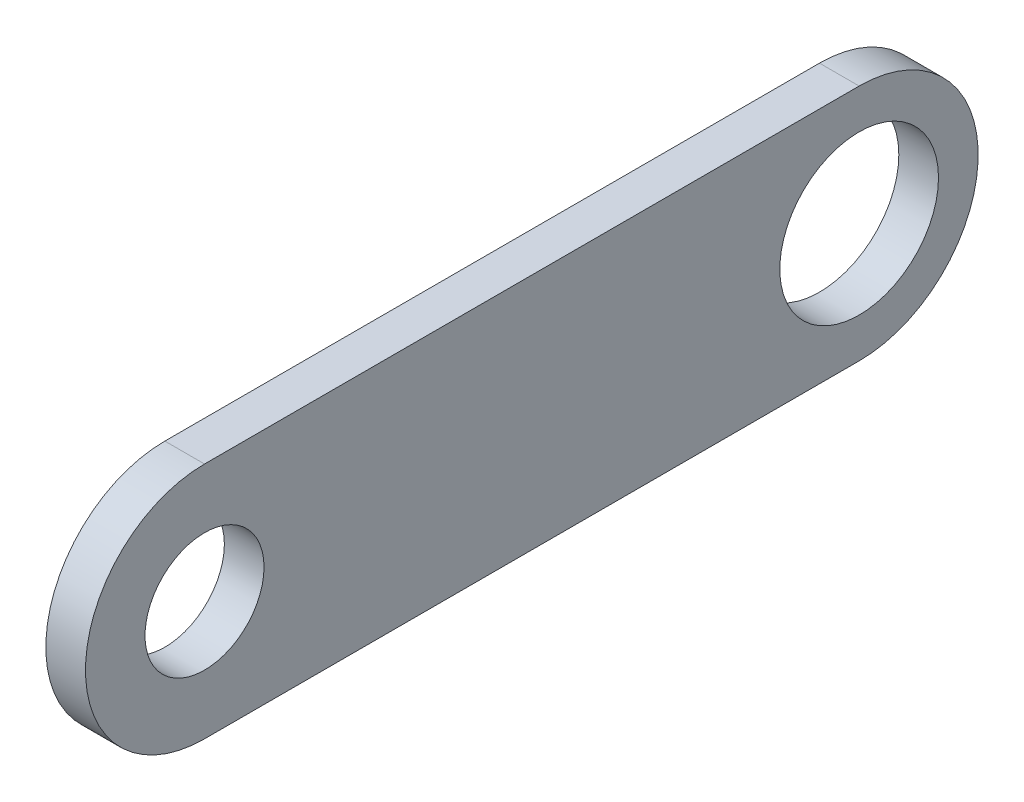
ISO-10303-21;
HEADER;
FILE_DESCRIPTION(('STEP AP214'),'2;1');
FILE_NAME('part.step','',(''),(''),'','','');
FILE_SCHEMA(('AUTOMOTIVE_DESIGN { 1 0 10303 214 1 1 1 1 }'));
ENDSEC;
DATA;
#1=APPLICATION_CONTEXT('core data for automotive mechanical design processes');
#2=APPLICATION_PROTOCOL_DEFINITION('international standard','automotive_design',2000,#1);
#3=PRODUCT_CONTEXT('',#1,'mechanical');
#4=PRODUCT('Part','Part','',(#3));
#5=PRODUCT_RELATED_PRODUCT_CATEGORY('part','',(#4));
#6=PRODUCT_DEFINITION_FORMATION('','',#4);
#7=PRODUCT_DEFINITION_CONTEXT('part definition',#1,'design');
#8=PRODUCT_DEFINITION('design','',#6,#7);
#9=PRODUCT_DEFINITION_SHAPE('','',#8);
#10=(LENGTH_UNIT() NAMED_UNIT(*) SI_UNIT(.MILLI.,.METRE.));
#11=(NAMED_UNIT(*) PLANE_ANGLE_UNIT() SI_UNIT($,.RADIAN.));
#12=(NAMED_UNIT(*) SI_UNIT($,.STERADIAN.) SOLID_ANGLE_UNIT());
#13=UNCERTAINTY_MEASURE_WITH_UNIT(LENGTH_MEASURE(1.E-05),#10,'distance_accuracy_value','');
#14=(GEOMETRIC_REPRESENTATION_CONTEXT(3) GLOBAL_UNCERTAINTY_ASSIGNED_CONTEXT((#13)) GLOBAL_UNIT_ASSIGNED_CONTEXT((#10,
#11,#12)) REPRESENTATION_CONTEXT('',''));
#15=CARTESIAN_POINT('',(0.,0.,0.));
#16=DIRECTION('',(0.,0.,1.));
#17=DIRECTION('',(1.,0.,0.));
#18=AXIS2_PLACEMENT_3D('',#15,#16,#17);
#19=CARTESIAN_POINT('',(2.,0.,-33.));
#20=DIRECTION('',(-1.,0.,0.));
#21=DIRECTION('',(0.,0.,1.));
#22=AXIS2_PLACEMENT_3D('',#19,#20,#21);
#23=CYLINDRICAL_SURFACE('',#22,6.);
#24=CARTESIAN_POINT('',(0.,0.,-33.));
#25=DIRECTION('',(-1.,0.,0.));
#26=DIRECTION('',(0.,0.,1.));
#27=AXIS2_PLACEMENT_3D('',#24,#25,#26);
#28=CIRCLE('',#27,6.);
#29=CARTESIAN_POINT('',(0.,6.,-33.));
#30=VERTEX_POINT('',#29);
#31=CARTESIAN_POINT('',(0.,-6.,-33.));
#32=VERTEX_POINT('',#31);
#33=EDGE_CURVE('E98',#30,#32,#28,.T.);
#34=ORIENTED_EDGE('',*,*,#33,.F.);
#35=DIRECTION('',(-1.,0.,0.));
#36=VECTOR('',#35,1.);
#37=CARTESIAN_POINT('',(2.,6.,-33.));
#38=LINE('',#37,#36);
#39=CARTESIAN_POINT('',(2.,6.,-33.));
#40=VERTEX_POINT('',#39);
#41=EDGE_CURVE('E11',#40,#30,#38,.T.);
#42=ORIENTED_EDGE('',*,*,#41,.F.);
#43=CARTESIAN_POINT('',(2.,0.,-33.));
#44=DIRECTION('',(-1.,0.,0.));
#45=DIRECTION('',(0.,0.,1.));
#46=AXIS2_PLACEMENT_3D('',#43,#44,#45);
#47=CIRCLE('',#46,6.);
#48=CARTESIAN_POINT('',(2.,-6.,-33.));
#49=VERTEX_POINT('',#48);
#50=EDGE_CURVE('E91',#40,#49,#47,.T.);
#51=ORIENTED_EDGE('',*,*,#50,.T.);
#52=DIRECTION('',(-1.,0.,0.));
#53=VECTOR('',#52,1.);
#54=CARTESIAN_POINT('',(2.,-6.,-33.));
#55=LINE('',#54,#53);
#56=EDGE_CURVE('E36',#49,#32,#55,.T.);
#57=ORIENTED_EDGE('',*,*,#56,.T.);
#58=EDGE_LOOP('',(#34,#42,#51,#57));
#59=FACE_BOUND('',#58,.T.);
#60=ADVANCED_FACE('F33',(#59),#23,.T.);
#61=CARTESIAN_POINT('',(2.,6.,0.));
#62=DIRECTION('',(0.,1.,0.));
#63=DIRECTION('',(0.,0.,1.));
#64=AXIS2_PLACEMENT_3D('',#61,#62,#63);
#65=PLANE('',#64);
#66=DIRECTION('',(0.,0.,-1.));
#67=VECTOR('',#66,1.);
#68=CARTESIAN_POINT('',(0.,6.,0.));
#69=LINE('',#68,#67);
#70=CARTESIAN_POINT('',(0.,6.,0.));
#71=VERTEX_POINT('',#70);
#72=EDGE_CURVE('E93',#71,#30,#69,.T.);
#73=ORIENTED_EDGE('',*,*,#72,.F.);
#74=DIRECTION('',(-1.,0.,0.));
#75=VECTOR('',#74,1.);
#76=CARTESIAN_POINT('',(2.,6.,0.));
#77=LINE('',#76,#75);
#78=CARTESIAN_POINT('',(2.,6.,0.));
#79=VERTEX_POINT('',#78);
#80=EDGE_CURVE('E42',#79,#71,#77,.T.);
#81=ORIENTED_EDGE('',*,*,#80,.F.);
#82=DIRECTION('',(0.,0.,-1.));
#83=VECTOR('',#82,1.);
#84=CARTESIAN_POINT('',(2.,6.,0.));
#85=LINE('',#84,#83);
#86=EDGE_CURVE('E88',#79,#40,#85,.T.);
#87=ORIENTED_EDGE('',*,*,#86,.T.);
#88=ORIENTED_EDGE('',*,*,#41,.T.);
#89=EDGE_LOOP('',(#73,#81,#87,#88));
#90=FACE_BOUND('',#89,.T.);
#91=ADVANCED_FACE('F109',(#90),#65,.T.);
#92=CARTESIAN_POINT('',(2.,0.,0.));
#93=DIRECTION('',(-1.,0.,0.));
#94=DIRECTION('',(0.,0.,1.));
#95=AXIS2_PLACEMENT_3D('',#92,#93,#94);
#96=CYLINDRICAL_SURFACE('',#95,6.);
#97=CARTESIAN_POINT('',(0.,0.,0.));
#98=DIRECTION('',(-1.,0.,0.));
#99=DIRECTION('',(0.,0.,1.));
#100=AXIS2_PLACEMENT_3D('',#97,#98,#99);
#101=CIRCLE('',#100,6.);
#102=CARTESIAN_POINT('',(0.,-6.,0.));
#103=VERTEX_POINT('',#102);
#104=EDGE_CURVE('E83',#103,#71,#101,.T.);
#105=ORIENTED_EDGE('',*,*,#104,.F.);
#106=DIRECTION('',(-1.,0.,0.));
#107=VECTOR('',#106,1.);
#108=CARTESIAN_POINT('',(2.,-6.,0.));
#109=LINE('',#108,#107);
#110=CARTESIAN_POINT('',(2.,-6.,0.));
#111=VERTEX_POINT('',#110);
#112=EDGE_CURVE('E78',#111,#103,#109,.T.);
#113=ORIENTED_EDGE('',*,*,#112,.F.);
#114=CARTESIAN_POINT('',(2.,0.,0.));
#115=DIRECTION('',(-1.,0.,0.));
#116=DIRECTION('',(0.,0.,1.));
#117=AXIS2_PLACEMENT_3D('',#114,#115,#116);
#118=CIRCLE('',#117,6.);
#119=EDGE_CURVE('E81',#111,#79,#118,.T.);
#120=ORIENTED_EDGE('',*,*,#119,.T.);
#121=ORIENTED_EDGE('',*,*,#80,.T.);
#122=EDGE_LOOP('',(#105,#113,#120,#121));
#123=FACE_BOUND('',#122,.T.);
#124=ADVANCED_FACE('F80',(#123),#96,.T.);
#125=CARTESIAN_POINT('',(2.,-6.,-33.));
#126=DIRECTION('',(0.,-1.,0.));
#127=DIRECTION('',(0.,0.,-1.));
#128=AXIS2_PLACEMENT_3D('',#125,#126,#127);
#129=PLANE('',#128);
#130=DIRECTION('',(0.,0.,1.));
#131=VECTOR('',#130,1.);
#132=CARTESIAN_POINT('',(0.,-6.,-33.));
#133=LINE('',#132,#131);
#134=EDGE_CURVE('E101',#32,#103,#133,.T.);
#135=ORIENTED_EDGE('',*,*,#134,.F.);
#136=ORIENTED_EDGE('',*,*,#56,.F.);
#137=DIRECTION('',(0.,0.,1.));
#138=VECTOR('',#137,1.);
#139=CARTESIAN_POINT('',(2.,-6.,-33.));
#140=LINE('',#139,#138);
#141=EDGE_CURVE('E87',#49,#111,#140,.T.);
#142=ORIENTED_EDGE('',*,*,#141,.T.);
#143=ORIENTED_EDGE('',*,*,#112,.T.);
#144=EDGE_LOOP('',(#135,#136,#142,#143));
#145=FACE_BOUND('',#144,.T.);
#146=ADVANCED_FACE('F90',(#145),#129,.T.);
#147=CARTESIAN_POINT('',(2.,0.,-33.));
#148=DIRECTION('',(-1.,0.,0.));
#149=DIRECTION('',(0.,0.,1.));
#150=AXIS2_PLACEMENT_3D('',#147,#148,#149);
#151=PLANE('',#150);
#152=CARTESIAN_POINT('',(2.,0.,-33.));
#153=DIRECTION('',(-1.,0.,0.));
#154=DIRECTION('',(0.,0.,-1.));
#155=AXIS2_PLACEMENT_3D('',#152,#153,#154);
#156=CIRCLE('',#155,4.);
#157=CARTESIAN_POINT('',(2.,0.,-37.));
#158=VERTEX_POINT('',#157);
#159=EDGE_CURVE('E142',#158,#158,#156,.T.);
#160=ORIENTED_EDGE('',*,*,#159,.T.);
#161=EDGE_LOOP('',(#160));
#162=FACE_BOUND('',#161,.T.);
#163=CARTESIAN_POINT('',(2.,0.,0.));
#164=DIRECTION('',(-1.,0.,0.));
#165=DIRECTION('',(0.,0.,-1.));
#166=AXIS2_PLACEMENT_3D('',#163,#164,#165);
#167=CIRCLE('',#166,3.);
#168=CARTESIAN_POINT('',(2.,0.,-3.));
#169=VERTEX_POINT('',#168);
#170=EDGE_CURVE('E102',#169,#169,#167,.T.);
#171=ORIENTED_EDGE('',*,*,#170,.T.);
#172=EDGE_LOOP('',(#171));
#173=FACE_BOUND('',#172,.T.);
#174=ORIENTED_EDGE('',*,*,#50,.F.);
#175=ORIENTED_EDGE('',*,*,#86,.F.);
#176=ORIENTED_EDGE('',*,*,#119,.F.);
#177=ORIENTED_EDGE('',*,*,#141,.F.);
#178=EDGE_LOOP('',(#174,#175,#176,#177));
#179=FACE_BOUND('',#178,.T.);
#180=ADVANCED_FACE('F86',(#162,#173,#179),#151,.F.);
#181=CARTESIAN_POINT('',(0.,0.,-33.));
#182=DIRECTION('',(-1.,0.,0.));
#183=DIRECTION('',(0.,0.,1.));
#184=AXIS2_PLACEMENT_3D('',#181,#182,#183);
#185=PLANE('',#184);
#186=CARTESIAN_POINT('',(0.,0.,-33.));
#187=DIRECTION('',(-1.,0.,0.));
#188=DIRECTION('',(0.,0.,-1.));
#189=AXIS2_PLACEMENT_3D('',#186,#187,#188);
#190=CIRCLE('',#189,4.);
#191=CARTESIAN_POINT('',(0.,0.,-37.));
#192=VERTEX_POINT('',#191);
#193=EDGE_CURVE('E145',#192,#192,#190,.T.);
#194=ORIENTED_EDGE('',*,*,#193,.F.);
#195=EDGE_LOOP('',(#194));
#196=FACE_BOUND('',#195,.T.);
#197=CARTESIAN_POINT('',(0.,0.,0.));
#198=DIRECTION('',(-1.,0.,0.));
#199=DIRECTION('',(0.,0.,-1.));
#200=AXIS2_PLACEMENT_3D('',#197,#198,#199);
#201=CIRCLE('',#200,3.);
#202=CARTESIAN_POINT('',(0.,0.,-3.));
#203=VERTEX_POINT('',#202);
#204=EDGE_CURVE('E147',#203,#203,#201,.T.);
#205=ORIENTED_EDGE('',*,*,#204,.F.);
#206=EDGE_LOOP('',(#205));
#207=FACE_BOUND('',#206,.T.);
#208=ORIENTED_EDGE('',*,*,#33,.T.);
#209=ORIENTED_EDGE('',*,*,#134,.T.);
#210=ORIENTED_EDGE('',*,*,#104,.T.);
#211=ORIENTED_EDGE('',*,*,#72,.T.);
#212=EDGE_LOOP('',(#208,#209,#210,#211));
#213=FACE_BOUND('',#212,.T.);
#214=ADVANCED_FACE('F108',(#196,#207,#213),#185,.T.);
#215=CARTESIAN_POINT('',(2.,0.,0.));
#216=DIRECTION('',(-1.,0.,0.));
#217=DIRECTION('',(0.,0.,1.));
#218=AXIS2_PLACEMENT_3D('',#215,#216,#217);
#219=CYLINDRICAL_SURFACE('',#218,3.);
#220=ORIENTED_EDGE('',*,*,#170,.F.);
#221=EDGE_LOOP('',(#220));
#222=FACE_BOUND('',#221,.T.);
#223=ORIENTED_EDGE('',*,*,#204,.T.);
#224=EDGE_LOOP('',(#223));
#225=FACE_BOUND('',#224,.T.);
#226=ADVANCED_FACE('F127',(#222,#225),#219,.F.);
#227=CARTESIAN_POINT('',(2.,0.,-33.));
#228=DIRECTION('',(-1.,0.,0.));
#229=DIRECTION('',(0.,0.,1.));
#230=AXIS2_PLACEMENT_3D('',#227,#228,#229);
#231=CYLINDRICAL_SURFACE('',#230,4.);
#232=ORIENTED_EDGE('',*,*,#159,.F.);
#233=EDGE_LOOP('',(#232));
#234=FACE_BOUND('',#233,.T.);
#235=ORIENTED_EDGE('',*,*,#193,.T.);
#236=EDGE_LOOP('',(#235));
#237=FACE_BOUND('',#236,.T.);
#238=ADVANCED_FACE('F134',(#234,#237),#231,.F.);
#239=CLOSED_SHELL('',(#60,#91,#124,#146,#180,#214,#226,#238));
#240=MANIFOLD_SOLID_BREP('B2',#239);
#241=ADVANCED_BREP_SHAPE_REPRESENTATION('',(#18,#240),#14);
#242=SHAPE_DEFINITION_REPRESENTATION(#9,#241);
ENDSEC;
END-ISO-10303-21;
